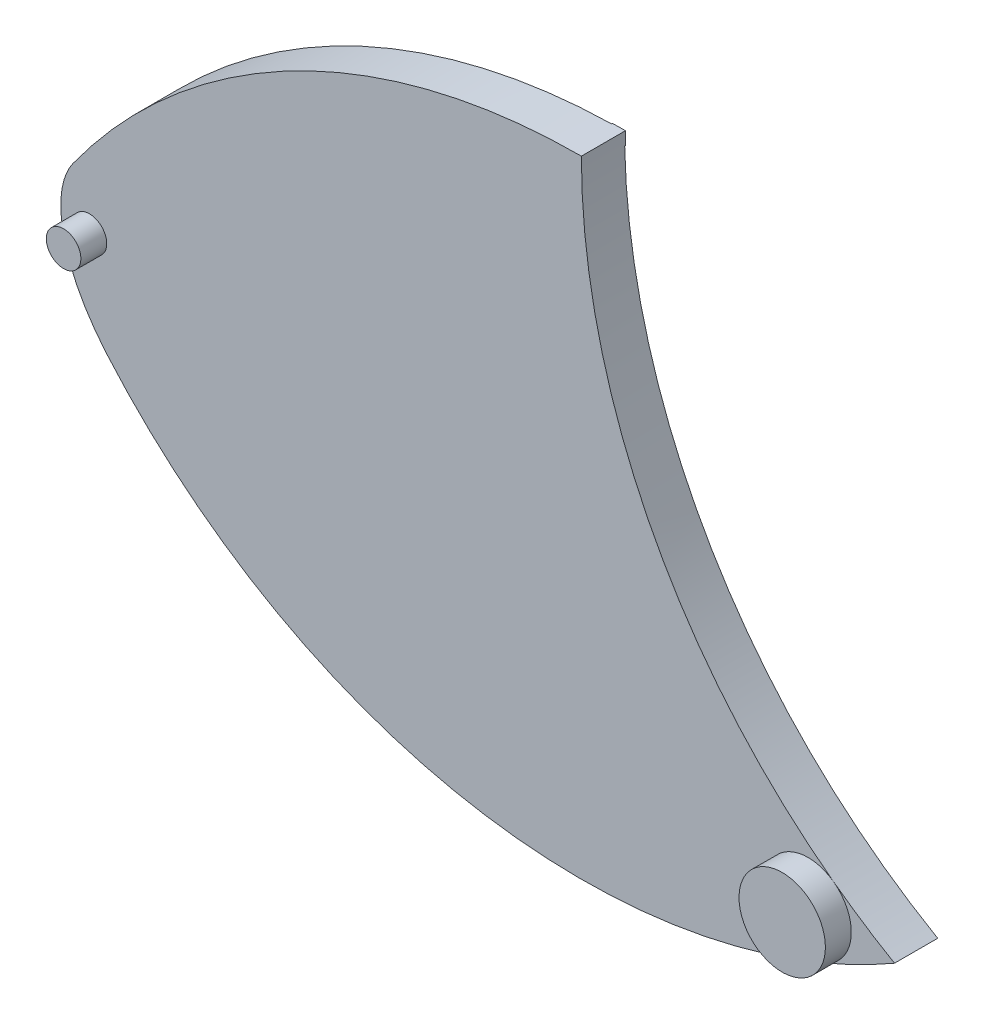
ISO-10303-21;
HEADER;
FILE_DESCRIPTION(('STEP AP214'),'2;1');
FILE_NAME('part.step','',(''),(''),'','','');
FILE_SCHEMA(('AUTOMOTIVE_DESIGN { 1 0 10303 214 1 1 1 1 }'));
ENDSEC;
DATA;
#1=APPLICATION_CONTEXT('core data for automotive mechanical design processes');
#2=APPLICATION_PROTOCOL_DEFINITION('international standard','automotive_design',2000,#1);
#3=PRODUCT_CONTEXT('',#1,'mechanical');
#4=PRODUCT('Part','Part','',(#3));
#5=PRODUCT_RELATED_PRODUCT_CATEGORY('part','',(#4));
#6=PRODUCT_DEFINITION_FORMATION('','',#4);
#7=PRODUCT_DEFINITION_CONTEXT('part definition',#1,'design');
#8=PRODUCT_DEFINITION('design','',#6,#7);
#9=PRODUCT_DEFINITION_SHAPE('','',#8);
#10=(LENGTH_UNIT() NAMED_UNIT(*) SI_UNIT(.MILLI.,.METRE.));
#11=(NAMED_UNIT(*) PLANE_ANGLE_UNIT() SI_UNIT($,.RADIAN.));
#12=(NAMED_UNIT(*) SI_UNIT($,.STERADIAN.) SOLID_ANGLE_UNIT());
#13=UNCERTAINTY_MEASURE_WITH_UNIT(LENGTH_MEASURE(1.E-05),#10,'distance_accuracy_value','');
#14=(GEOMETRIC_REPRESENTATION_CONTEXT(3) GLOBAL_UNCERTAINTY_ASSIGNED_CONTEXT((#13)) GLOBAL_UNIT_ASSIGNED_CONTEXT((#10,
#11,#12)) REPRESENTATION_CONTEXT('',''));
#15=CARTESIAN_POINT('',(0.,0.,0.));
#16=DIRECTION('',(0.,0.,1.));
#17=DIRECTION('',(1.,0.,0.));
#18=AXIS2_PLACEMENT_3D('',#15,#16,#17);
#19=CARTESIAN_POINT('',(0.,-36.25,5.));
#20=DIRECTION('',(0.,0.,-1.));
#21=DIRECTION('',(-1.,0.,0.));
#22=AXIS2_PLACEMENT_3D('',#19,#20,#21);
#23=PLANE('',#22);
#24=CARTESIAN_POINT('',(26.25,-62.1867148191638,5.));
#25=DIRECTION('',(0.,0.,1.));
#26=DIRECTION('',(1.,0.,0.));
#27=AXIS2_PLACEMENT_3D('',#24,#25,#26);
#28=CIRCLE('',#27,5.00000000000001);
#29=CARTESIAN_POINT('',(28.1944444444445,-66.7931381391018,5.));
#30=VERTEX_POINT('',#29);
#31=CARTESIAN_POINT('',(29.233870967742,-58.1746687017983,5.));
#32=VERTEX_POINT('',#31);
#33=EDGE_CURVE('E141',#30,#32,#28,.T.);
#34=ORIENTED_EDGE('',*,*,#33,.F.);
#35=CARTESIAN_POINT('',(0.,0.,5.));
#36=DIRECTION('',(0.,0.,1.));
#37=DIRECTION('',(-1.,0.,0.));
#38=AXIS2_PLACEMENT_3D('',#35,#36,#37);
#39=CIRCLE('',#38,72.5);
#40=CARTESIAN_POINT('',(36.25,-62.7868417743718,5.));
#41=VERTEX_POINT('',#40);
#42=EDGE_CURVE('E160',#30,#41,#39,.T.);
#43=ORIENTED_EDGE('',*,*,#42,.T.);
#44=CARTESIAN_POINT('',(72.5,0.,5.));
#45=DIRECTION('',(0.,0.,-1.));
#46=DIRECTION('',(-1.,0.,0.));
#47=AXIS2_PLACEMENT_3D('',#44,#45,#46);
#48=CIRCLE('',#47,72.5);
#49=EDGE_CURVE('E162',#41,#32,#48,.T.);
#50=ORIENTED_EDGE('',*,*,#49,.T.);
#51=EDGE_LOOP('',(#34,#43,#50));
#52=FACE_BOUND('',#51,.T.);
#53=ADVANCED_FACE('F47',(#52),#23,.F.);
#54=CARTESIAN_POINT('',(0.,0.,5.));
#55=DIRECTION('',(0.,0.,-1.));
#56=DIRECTION('',(-1.,0.,0.));
#57=AXIS2_PLACEMENT_3D('',#54,#55,#56);
#58=CYLINDRICAL_SURFACE('',#57,72.5);
#59=CARTESIAN_POINT('',(-54.9383036786294,-47.3078512396694,5.));
#60=VERTEX_POINT('',#59);
#61=EDGE_CURVE('E168',#60,#30,#39,.T.);
#62=ORIENTED_EDGE('',*,*,#61,.F.);
#63=CARTESIAN_POINT('',(-54.9383036786294,-47.3078512396694,-0.25));
#64=CARTESIAN_POINT('',(-54.9383036786294,-47.3078512396694,1.58333333333334));
#65=CARTESIAN_POINT('',(-54.9383036786294,-47.3078512396694,3.41666666666666));
#66=CARTESIAN_POINT('',(-54.9383036786294,-47.3078512396694,5.25));
#67=(BOUNDED_CURVE() B_SPLINE_CURVE(3,(#63,#64,#65,#66),.UNSPECIFIED.,.F.,
.F.) B_SPLINE_CURVE_WITH_KNOTS((4,4),(-0.00025,0.00525),
.UNSPECIFIED.) CURVE() GEOMETRIC_REPRESENTATION_ITEM() RATIONAL_B_SPLINE_CURVE((1.,1.,1.,1.)) REPRESENTATION_ITEM(''));
#68=CARTESIAN_POINT('',(-54.9383036786294,-47.3078512396694,0.));
#69=VERTEX_POINT('',#68);
#70=EDGE_CURVE('E226',#60,#69,#67,.F.);
#71=ORIENTED_EDGE('',*,*,#70,.T.);
#72=CARTESIAN_POINT('',(0.,0.,0.));
#73=DIRECTION('',(0.,0.,1.));
#74=DIRECTION('',(-1.,0.,0.));
#75=AXIS2_PLACEMENT_3D('',#72,#73,#74);
#76=CIRCLE('',#75,72.5);
#77=CARTESIAN_POINT('',(36.25,-62.7868417743718,0.));
#78=VERTEX_POINT('',#77);
#79=EDGE_CURVE('E222',#69,#78,#76,.T.);
#80=ORIENTED_EDGE('',*,*,#79,.T.);
#81=DIRECTION('',(0.,0.,-1.));
#82=VECTOR('',#81,1.);
#83=CARTESIAN_POINT('',(36.25,-62.7868417743718,5.));
#84=LINE('',#83,#82);
#85=EDGE_CURVE('E122',#41,#78,#84,.T.);
#86=ORIENTED_EDGE('',*,*,#85,.F.);
#87=ORIENTED_EDGE('',*,*,#42,.F.);
#88=EDGE_LOOP('',(#62,#71,#80,#86,#87));
#89=FACE_BOUND('',#88,.T.);
#90=ADVANCED_FACE('F203',(#89),#58,.T.);
#91=CARTESIAN_POINT('',(72.5,0.,5.));
#92=DIRECTION('',(0.,0.,-1.));
#93=DIRECTION('',(-1.,0.,0.));
#94=AXIS2_PLACEMENT_3D('',#91,#92,#93);
#95=CYLINDRICAL_SURFACE('',#94,72.5);
#96=CARTESIAN_POINT('',(72.5,0.,0.));
#97=DIRECTION('',(0.,0.,-1.));
#98=DIRECTION('',(-1.,0.,0.));
#99=AXIS2_PLACEMENT_3D('',#96,#97,#98);
#100=CIRCLE('',#99,72.5);
#101=CARTESIAN_POINT('',(0.015517241379312,-1.49991973625937,0.));
#102=VERTEX_POINT('',#101);
#103=EDGE_CURVE('E241',#78,#102,#100,.T.);
#104=ORIENTED_EDGE('',*,*,#103,.T.);
#105=DIRECTION('',(0.,0.,1.));
#106=VECTOR('',#105,1.);
#107=CARTESIAN_POINT('',(0.0155172413793254,-1.49991973625924,-0.1));
#108=LINE('',#107,#106);
#109=CARTESIAN_POINT('',(0.0155172413793254,-1.49991973625924,-0.1));
#110=VERTEX_POINT('',#109);
#111=EDGE_CURVE('E134',#110,#102,#108,.T.);
#112=ORIENTED_EDGE('',*,*,#111,.F.);
#113=CARTESIAN_POINT('',(72.5,0.,-0.1));
#114=DIRECTION('',(0.,0.,-1.));
#115=DIRECTION('',(-1.,0.,0.));
#116=AXIS2_PLACEMENT_3D('',#113,#114,#115);
#117=CIRCLE('',#116,72.5);
#118=CARTESIAN_POINT('',(0.,0.,-0.1));
#119=VERTEX_POINT('',#118);
#120=EDGE_CURVE('E127',#110,#119,#117,.T.);
#121=ORIENTED_EDGE('',*,*,#120,.T.);
#122=DIRECTION('',(0.,0.,-1.));
#123=VECTOR('',#122,1.);
#124=CARTESIAN_POINT('',(0.,0.,5.));
#125=LINE('',#124,#123);
#126=CARTESIAN_POINT('',(0.,0.,5.));
#127=VERTEX_POINT('',#126);
#128=EDGE_CURVE('E113',#127,#119,#125,.T.);
#129=ORIENTED_EDGE('',*,*,#128,.F.);
#130=EDGE_CURVE('E165',#32,#127,#48,.T.);
#131=ORIENTED_EDGE('',*,*,#130,.F.);
#132=ORIENTED_EDGE('',*,*,#49,.F.);
#133=ORIENTED_EDGE('',*,*,#85,.T.);
#134=EDGE_LOOP('',(#104,#112,#121,#129,#131,#132,#133));
#135=FACE_BOUND('',#134,.T.);
#136=ADVANCED_FACE('F132',(#135),#95,.F.);
#137=CARTESIAN_POINT('',(0.,-72.5,5.));
#138=DIRECTION('',(0.,0.,-1.));
#139=DIRECTION('',(-1.,0.,0.));
#140=AXIS2_PLACEMENT_3D('',#137,#138,#139);
#141=CYLINDRICAL_SURFACE('',#140,72.5);
#142=ORIENTED_EDGE('',*,*,#128,.T.);
#143=CARTESIAN_POINT('',(0.,-72.5,-0.1));
#144=DIRECTION('',(0.,0.,-1.));
#145=DIRECTION('',(-1.,0.,0.));
#146=AXIS2_PLACEMENT_3D('',#143,#144,#145);
#147=CIRCLE('',#146,72.5);
#148=CARTESIAN_POINT('',(-1.49991973625924,-0.0155172413793126,-0.1));
#149=VERTEX_POINT('',#148);
#150=EDGE_CURVE('E117',#149,#119,#147,.T.);
#151=ORIENTED_EDGE('',*,*,#150,.F.);
#152=DIRECTION('',(0.,0.,1.));
#153=VECTOR('',#152,1.);
#154=CARTESIAN_POINT('',(-1.49991973625924,-0.0155172413793126,-0.1));
#155=LINE('',#154,#153);
#156=CARTESIAN_POINT('',(-1.49991973625924,-0.0155172413793126,0.));
#157=VERTEX_POINT('',#156);
#158=EDGE_CURVE('E138',#149,#157,#155,.T.);
#159=ORIENTED_EDGE('',*,*,#158,.T.);
#160=CARTESIAN_POINT('',(0.,-72.5,0.));
#161=DIRECTION('',(0.,0.,1.));
#162=DIRECTION('',(-1.,0.,0.));
#163=AXIS2_PLACEMENT_3D('',#160,#161,#162);
#164=CIRCLE('',#163,72.5);
#165=CARTESIAN_POINT('',(-58.827741107205,-30.1261061946903,0.));
#166=VERTEX_POINT('',#165);
#167=EDGE_CURVE('E55',#157,#166,#164,.T.);
#168=ORIENTED_EDGE('',*,*,#167,.T.);
#169=CARTESIAN_POINT('',(-58.827741107205,-30.1261061946903,5.25));
#170=CARTESIAN_POINT('',(-58.827741107205,-30.1261061946903,3.41666666666666));
#171=CARTESIAN_POINT('',(-58.827741107205,-30.1261061946903,1.58333333333334));
#172=CARTESIAN_POINT('',(-58.827741107205,-30.1261061946903,-0.25));
#173=(BOUNDED_CURVE() B_SPLINE_CURVE(3,(#169,#170,#171,#172),.UNSPECIFIED.,.F.,
.F.) B_SPLINE_CURVE_WITH_KNOTS((4,4),(-0.00025,0.00525),
.UNSPECIFIED.) CURVE() GEOMETRIC_REPRESENTATION_ITEM() RATIONAL_B_SPLINE_CURVE((1.,1.,1.,1.)) REPRESENTATION_ITEM(''));
#174=CARTESIAN_POINT('',(-58.827741107205,-30.1261061946903,5.));
#175=VERTEX_POINT('',#174);
#176=EDGE_CURVE('E61',#166,#175,#173,.F.);
#177=ORIENTED_EDGE('',*,*,#176,.T.);
#178=CARTESIAN_POINT('',(0.,-72.5,5.));
#179=DIRECTION('',(0.,0.,1.));
#180=DIRECTION('',(-1.,0.,0.));
#181=AXIS2_PLACEMENT_3D('',#178,#179,#180);
#182=CIRCLE('',#181,72.5);
#183=EDGE_CURVE('E119',#127,#175,#182,.T.);
#184=ORIENTED_EDGE('',*,*,#183,.F.);
#185=EDGE_LOOP('',(#142,#151,#159,#168,#177,#184));
#186=FACE_BOUND('',#185,.T.);
#187=ADVANCED_FACE('F115',(#186),#141,.T.);
#188=EDGE_CURVE('E76',#32,#30,#28,.T.);
#189=ORIENTED_EDGE('',*,*,#188,.F.);
#190=ORIENTED_EDGE('',*,*,#130,.T.);
#191=ORIENTED_EDGE('',*,*,#183,.T.);
#192=CARTESIAN_POINT('',(-54.9383036786294,-47.3078512396694,5.));
#193=CARTESIAN_POINT('',(-63.7951833431966,-37.0224137931034,5.));
#194=CARTESIAN_POINT('',(-58.827741107205,-30.1261061946903,5.));
#195=(BOUNDED_CURVE() B_SPLINE_CURVE(2,(#192,#193,#194),.UNSPECIFIED.,.F.,
.F.) B_SPLINE_CURVE_WITH_KNOTS((3,3),(0.,1.),
.UNSPECIFIED.) CURVE() GEOMETRIC_REPRESENTATION_ITEM() RATIONAL_B_SPLINE_CURVE((1.,
0.785330936163195,1.)) REPRESENTATION_ITEM(''));
#196=EDGE_CURVE('E12',#175,#60,#195,.F.);
#197=ORIENTED_EDGE('',*,*,#196,.T.);
#198=ORIENTED_EDGE('',*,*,#61,.T.);
#199=EDGE_LOOP('',(#189,#190,#191,#197,#198));
#200=FACE_BOUND('',#199,.T.);
#201=CARTESIAN_POINT('',(-56.9402098696519,-36.25,5.));
#202=DIRECTION('',(0.,0.,-1.));
#203=DIRECTION('',(-1.,0.,0.));
#204=AXIS2_PLACEMENT_3D('',#201,#202,#203);
#205=CIRCLE('',#204,2.);
#206=CARTESIAN_POINT('',(-58.9402098696519,-36.25,5.));
#207=VERTEX_POINT('',#206);
#208=EDGE_CURVE('E247',#207,#207,#205,.F.);
#209=ORIENTED_EDGE('',*,*,#208,.F.);
#210=EDGE_LOOP('',(#209));
#211=FACE_BOUND('',#210,.T.);
#212=ADVANCED_FACE('F198',(#200,#211),#23,.F.);
#213=CARTESIAN_POINT('',(0.,-36.25,0.));
#214=DIRECTION('',(0.,0.,-1.));
#215=DIRECTION('',(-1.,0.,0.));
#216=AXIS2_PLACEMENT_3D('',#213,#214,#215);
#217=PLANE('',#216);
#218=CARTESIAN_POINT('',(0.,0.,0.));
#219=DIRECTION('',(0.,0.,-1.));
#220=DIRECTION('',(-1.,0.,0.));
#221=AXIS2_PLACEMENT_3D('',#218,#219,#220);
#222=CIRCLE('',#221,1.5);
#223=EDGE_CURVE('E68',#102,#157,#222,.T.);
#224=ORIENTED_EDGE('',*,*,#223,.F.);
#225=ORIENTED_EDGE('',*,*,#103,.F.);
#226=ORIENTED_EDGE('',*,*,#79,.F.);
#227=CARTESIAN_POINT('',(-58.827741107205,-30.1261061946903,0.));
#228=CARTESIAN_POINT('',(-63.7951833431966,-37.0224137931034,0.));
#229=CARTESIAN_POINT('',(-54.9383036786294,-47.3078512396694,0.));
#230=(BOUNDED_CURVE() B_SPLINE_CURVE(2,(#227,#228,#229),.UNSPECIFIED.,.F.,
.F.) B_SPLINE_CURVE_WITH_KNOTS((3,3),(0.,1.),
.UNSPECIFIED.) CURVE() GEOMETRIC_REPRESENTATION_ITEM() RATIONAL_B_SPLINE_CURVE((1.,
0.785330936163195,1.)) REPRESENTATION_ITEM(''));
#231=EDGE_CURVE('E220',#69,#166,#230,.F.);
#232=ORIENTED_EDGE('',*,*,#231,.T.);
#233=ORIENTED_EDGE('',*,*,#167,.F.);
#234=EDGE_LOOP('',(#224,#225,#226,#232,#233));
#235=FACE_BOUND('',#234,.T.);
#236=CARTESIAN_POINT('',(26.25,-62.1867148191638,0.));
#237=DIRECTION('',(0.,0.,1.));
#238=DIRECTION('',(1.,0.,0.));
#239=AXIS2_PLACEMENT_3D('',#236,#237,#238);
#240=CIRCLE('',#239,2.25);
#241=CARTESIAN_POINT('',(28.5,-62.1867148191638,0.));
#242=VERTEX_POINT('',#241);
#243=EDGE_CURVE('E440',#242,#242,#240,.T.);
#244=ORIENTED_EDGE('',*,*,#243,.T.);
#245=EDGE_LOOP('',(#244));
#246=FACE_BOUND('',#245,.T.);
#247=ADVANCED_FACE('F199',(#235,#246),#217,.T.);
#248=CARTESIAN_POINT('',(-56.9402098696519,-36.25,8.));
#249=DIRECTION('',(0.,0.,-1.));
#250=DIRECTION('',(-1.,0.,0.));
#251=AXIS2_PLACEMENT_3D('',#248,#249,#250);
#252=CYLINDRICAL_SURFACE('',#251,2.);
#253=CARTESIAN_POINT('',(-56.9402098696519,-36.25,8.));
#254=DIRECTION('',(0.,0.,1.));
#255=DIRECTION('',(1.,0.,0.));
#256=AXIS2_PLACEMENT_3D('',#253,#254,#255);
#257=CIRCLE('',#256,2.);
#258=CARTESIAN_POINT('',(-54.9402098696519,-36.25,8.));
#259=VERTEX_POINT('',#258);
#260=EDGE_CURVE('E242',#259,#259,#257,.T.);
#261=ORIENTED_EDGE('',*,*,#260,.F.);
#262=EDGE_LOOP('',(#261));
#263=FACE_BOUND('',#262,.T.);
#264=ORIENTED_EDGE('',*,*,#208,.T.);
#265=EDGE_LOOP('',(#264));
#266=FACE_BOUND('',#265,.T.);
#267=ADVANCED_FACE('F279',(#263,#266),#252,.T.);
#268=CARTESIAN_POINT('',(-56.9402098696519,-36.25,8.));
#269=DIRECTION('',(0.,0.,1.));
#270=DIRECTION('',(1.,0.,0.));
#271=AXIS2_PLACEMENT_3D('',#268,#269,#270);
#272=PLANE('',#271);
#273=ORIENTED_EDGE('',*,*,#260,.T.);
#274=EDGE_LOOP('',(#273));
#275=FACE_BOUND('',#274,.T.);
#276=ADVANCED_FACE('F282',(#275),#272,.T.);
#277=CARTESIAN_POINT('',(26.25,-62.1867148191638,0.));
#278=DIRECTION('',(0.,0.,1.));
#279=DIRECTION('',(1.,0.,0.));
#280=AXIS2_PLACEMENT_3D('',#277,#278,#279);
#281=CYLINDRICAL_SURFACE('',#280,2.25);
#282=ORIENTED_EDGE('',*,*,#243,.F.);
#283=EDGE_LOOP('',(#282));
#284=FACE_BOUND('',#283,.T.);
#285=CARTESIAN_POINT('',(26.25,-62.1867148191638,5.));
#286=DIRECTION('',(0.,0.,1.));
#287=DIRECTION('',(1.,0.,0.));
#288=AXIS2_PLACEMENT_3D('',#285,#286,#287);
#289=CIRCLE('',#288,2.25);
#290=CARTESIAN_POINT('',(28.5,-62.1867148191638,5.));
#291=VERTEX_POINT('',#290);
#292=EDGE_CURVE('E146',#291,#291,#289,.F.);
#293=ORIENTED_EDGE('',*,*,#292,.F.);
#294=EDGE_LOOP('',(#293));
#295=FACE_BOUND('',#294,.T.);
#296=ADVANCED_FACE('F286',(#284,#295),#281,.F.);
#297=CARTESIAN_POINT('',(-54.9383036786294,-47.3078512396694,5.25));
#298=CARTESIAN_POINT('',(-54.9383036786294,-47.3078512396694,3.41666666666666));
#299=CARTESIAN_POINT('',(-54.9383036786294,-47.3078512396694,1.58333333333334));
#300=CARTESIAN_POINT('',(-54.9383036786294,-47.3078512396694,-0.25));
#301=CARTESIAN_POINT('',(-63.7951833431966,-37.0224137931034,5.25));
#302=CARTESIAN_POINT('',(-63.7951833431966,-37.0224137931034,3.41666666666666));
#303=CARTESIAN_POINT('',(-63.7951833431966,-37.0224137931034,1.58333333333334));
#304=CARTESIAN_POINT('',(-63.7951833431966,-37.0224137931034,-0.25));
#305=CARTESIAN_POINT('',(-58.827741107205,-30.1261061946903,5.25));
#306=CARTESIAN_POINT('',(-58.827741107205,-30.1261061946903,3.41666666666666));
#307=CARTESIAN_POINT('',(-58.827741107205,-30.1261061946903,1.58333333333334));
#308=CARTESIAN_POINT('',(-58.827741107205,-30.1261061946903,-0.25));
#309=(BOUNDED_SURFACE() B_SPLINE_SURFACE(2,3,((#297,#298,#299,#300),(#301,#302,#303,#304),(#305,
#306,#307,#308)),.UNSPECIFIED.,.F.,.F.,.F.) B_SPLINE_SURFACE_WITH_KNOTS((3,3),(4,4),(0.,1.),
(-0.00025,0.00525),
.UNSPECIFIED.) GEOMETRIC_REPRESENTATION_ITEM() RATIONAL_B_SPLINE_SURFACE(((1.,1.,1.,1.),
(0.785330936163195,0.785330936163195,0.785330936163195,0.785330936163195),(1.,1.,1.,1.))) REPRESENTATION_ITEM('') SURFACE());
#310=ORIENTED_EDGE('',*,*,#196,.F.);
#311=ORIENTED_EDGE('',*,*,#176,.F.);
#312=ORIENTED_EDGE('',*,*,#231,.F.);
#313=ORIENTED_EDGE('',*,*,#70,.F.);
#314=EDGE_LOOP('',(#310,#311,#312,#313));
#315=FACE_BOUND('',#314,.T.);
#316=ADVANCED_FACE('F50',(#315),#309,.T.);
#317=CARTESIAN_POINT('',(26.25,-62.1867148191638,5.));
#318=DIRECTION('',(0.,0.,1.));
#319=DIRECTION('',(1.,0.,0.));
#320=AXIS2_PLACEMENT_3D('',#317,#318,#319);
#321=PLANE('',#320);
#322=ORIENTED_EDGE('',*,*,#292,.T.);
#323=EDGE_LOOP('',(#322));
#324=FACE_BOUND('',#323,.T.);
#325=ADVANCED_FACE('F294',(#324),#321,.F.);
#326=CARTESIAN_POINT('',(26.25,-62.1867148191638,8.));
#327=DIRECTION('',(0.,0.,-1.));
#328=DIRECTION('',(-1.,0.,0.));
#329=AXIS2_PLACEMENT_3D('',#326,#327,#328);
#330=CYLINDRICAL_SURFACE('',#329,5.00000000000001);
#331=CARTESIAN_POINT('',(26.25,-62.1867148191638,8.));
#332=DIRECTION('',(0.,0.,1.));
#333=DIRECTION('',(1.,0.,0.));
#334=AXIS2_PLACEMENT_3D('',#331,#332,#333);
#335=CIRCLE('',#334,5.00000000000001);
#336=CARTESIAN_POINT('',(31.25,-62.1867148191638,8.));
#337=VERTEX_POINT('',#336);
#338=EDGE_CURVE('E143',#337,#337,#335,.T.);
#339=ORIENTED_EDGE('',*,*,#338,.F.);
#340=EDGE_LOOP('',(#339));
#341=FACE_BOUND('',#340,.T.);
#342=ORIENTED_EDGE('',*,*,#188,.T.);
#343=ORIENTED_EDGE('',*,*,#33,.T.);
#344=EDGE_LOOP('',(#342,#343));
#345=FACE_BOUND('',#344,.T.);
#346=ADVANCED_FACE('F156',(#341,#345),#330,.T.);
#347=CARTESIAN_POINT('',(26.25,-62.1867148191638,8.));
#348=DIRECTION('',(0.,0.,1.));
#349=DIRECTION('',(1.,0.,0.));
#350=AXIS2_PLACEMENT_3D('',#347,#348,#349);
#351=PLANE('',#350);
#352=ORIENTED_EDGE('',*,*,#338,.T.);
#353=EDGE_LOOP('',(#352));
#354=FACE_BOUND('',#353,.T.);
#355=ADVANCED_FACE('F293',(#354),#351,.T.);
#356=CARTESIAN_POINT('',(0.,0.,-0.1));
#357=DIRECTION('',(0.,0.,1.));
#358=DIRECTION('',(1.,0.,0.));
#359=AXIS2_PLACEMENT_3D('',#356,#357,#358);
#360=CYLINDRICAL_SURFACE('',#359,1.5);
#361=ORIENTED_EDGE('',*,*,#223,.T.);
#362=ORIENTED_EDGE('',*,*,#158,.F.);
#363=CARTESIAN_POINT('',(0.,0.,-0.1));
#364=DIRECTION('',(0.,0.,-1.));
#365=DIRECTION('',(-1.,0.,0.));
#366=AXIS2_PLACEMENT_3D('',#363,#364,#365);
#367=CIRCLE('',#366,1.5);
#368=EDGE_CURVE('E129',#110,#149,#367,.T.);
#369=ORIENTED_EDGE('',*,*,#368,.F.);
#370=ORIENTED_EDGE('',*,*,#111,.T.);
#371=EDGE_LOOP('',(#361,#362,#369,#370));
#372=FACE_BOUND('',#371,.T.);
#373=ADVANCED_FACE('F301',(#372),#360,.T.);
#374=CARTESIAN_POINT('',(36.25,-36.25,-0.1));
#375=DIRECTION('',(0.,0.,-1.));
#376=DIRECTION('',(-1.,0.,0.));
#377=AXIS2_PLACEMENT_3D('',#374,#375,#376);
#378=PLANE('',#377);
#379=ORIENTED_EDGE('',*,*,#120,.F.);
#380=ORIENTED_EDGE('',*,*,#368,.T.);
#381=ORIENTED_EDGE('',*,*,#150,.T.);
#382=EDGE_LOOP('',(#379,#380,#381));
#383=FACE_BOUND('',#382,.T.);
#384=ADVANCED_FACE('F126',(#383),#378,.T.);
#385=CLOSED_SHELL('',(#53,#90,#136,#187,#212,#247,#267,#276,#296,#316,#325,#346,#355,#373,#384));
#386=MANIFOLD_SOLID_BREP('B2',#385);
#387=ADVANCED_BREP_SHAPE_REPRESENTATION('',(#18,#386),#14);
#388=SHAPE_DEFINITION_REPRESENTATION(#9,#387);
ENDSEC;
END-ISO-10303-21;
